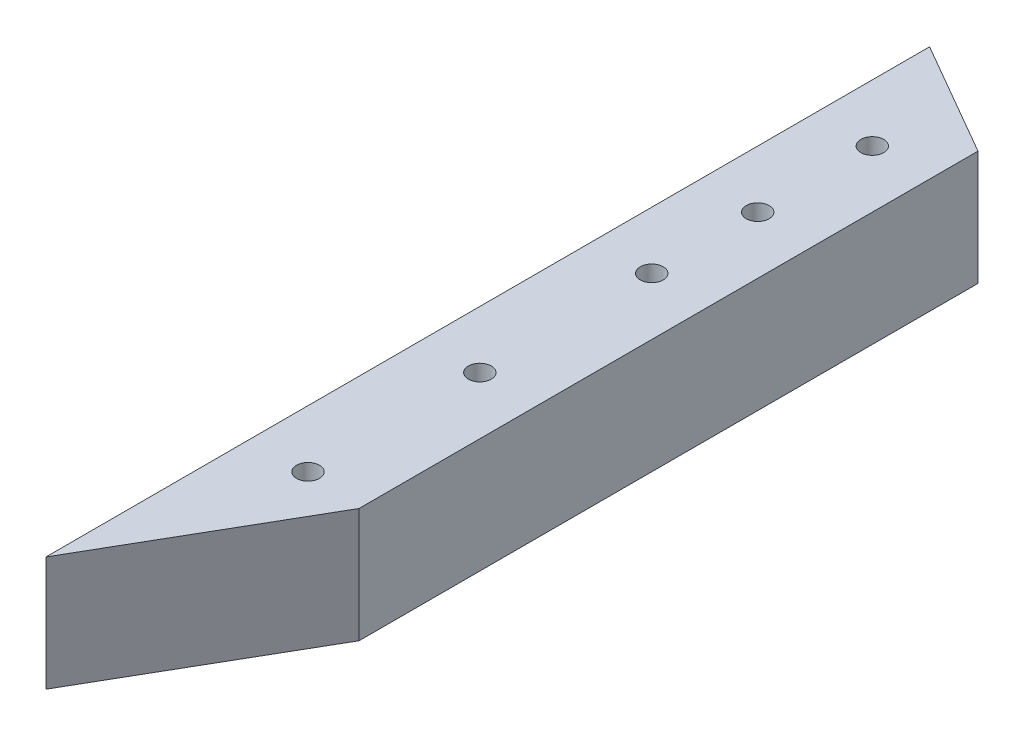
ISO-10303-21;
HEADER;
FILE_DESCRIPTION(('STEP AP214'),'2;1');
FILE_NAME('part.step','',(''),(''),'','','');
FILE_SCHEMA(('AUTOMOTIVE_DESIGN { 1 0 10303 214 1 1 1 1 }'));
ENDSEC;
DATA;
#1=APPLICATION_CONTEXT('core data for automotive mechanical design processes');
#2=APPLICATION_PROTOCOL_DEFINITION('international standard','automotive_design',2000,#1);
#3=PRODUCT_CONTEXT('',#1,'mechanical');
#4=PRODUCT('Part','Part','',(#3));
#5=PRODUCT_RELATED_PRODUCT_CATEGORY('part','',(#4));
#6=PRODUCT_DEFINITION_FORMATION('','',#4);
#7=PRODUCT_DEFINITION_CONTEXT('part definition',#1,'design');
#8=PRODUCT_DEFINITION('design','',#6,#7);
#9=PRODUCT_DEFINITION_SHAPE('','',#8);
#10=(LENGTH_UNIT() NAMED_UNIT(*) SI_UNIT(.MILLI.,.METRE.));
#11=(NAMED_UNIT(*) PLANE_ANGLE_UNIT() SI_UNIT($,.RADIAN.));
#12=(NAMED_UNIT(*) SI_UNIT($,.STERADIAN.) SOLID_ANGLE_UNIT());
#13=UNCERTAINTY_MEASURE_WITH_UNIT(LENGTH_MEASURE(1.E-05),#10,'distance_accuracy_value','');
#14=(GEOMETRIC_REPRESENTATION_CONTEXT(3) GLOBAL_UNCERTAINTY_ASSIGNED_CONTEXT((#13)) GLOBAL_UNIT_ASSIGNED_CONTEXT((#10,
#11,#12)) REPRESENTATION_CONTEXT('',''));
#15=CARTESIAN_POINT('',(0.,0.,0.));
#16=DIRECTION('',(0.,0.,1.));
#17=DIRECTION('',(1.,0.,0.));
#18=AXIS2_PLACEMENT_3D('',#15,#16,#17);
#19=CARTESIAN_POINT('',(0.,0.,154.23));
#20=DIRECTION('',(1.,0.,0.));
#21=DIRECTION('',(0.,0.,-1.));
#22=AXIS2_PLACEMENT_3D('',#19,#20,#21);
#23=PLANE('',#22);
#24=DIRECTION('',(0.,-1.,0.));
#25=VECTOR('',#24,1.);
#26=CARTESIAN_POINT('',(0.,0.,0.));
#27=LINE('',#26,#25);
#28=CARTESIAN_POINT('',(0.,20.,0.));
#29=VERTEX_POINT('',#28);
#30=CARTESIAN_POINT('',(0.,0.,0.));
#31=VERTEX_POINT('',#30);
#32=EDGE_CURVE('E96',#29,#31,#27,.T.);
#33=ORIENTED_EDGE('',*,*,#32,.T.);
#34=DIRECTION('',(0.,0.,-1.));
#35=VECTOR('',#34,1.);
#36=CARTESIAN_POINT('',(0.,0.,154.23));
#37=LINE('',#36,#35);
#38=CARTESIAN_POINT('',(0.,0.,154.23));
#39=VERTEX_POINT('',#38);
#40=EDGE_CURVE('E11',#39,#31,#37,.T.);
#41=ORIENTED_EDGE('',*,*,#40,.F.);
#42=DIRECTION('',(0.,-1.,0.));
#43=VECTOR('',#42,1.);
#44=CARTESIAN_POINT('',(0.,0.,154.23));
#45=LINE('',#44,#43);
#46=CARTESIAN_POINT('',(0.,20.,154.23));
#47=VERTEX_POINT('',#46);
#48=EDGE_CURVE('E93',#47,#39,#45,.T.);
#49=ORIENTED_EDGE('',*,*,#48,.F.);
#50=DIRECTION('',(0.,0.,-1.));
#51=VECTOR('',#50,1.);
#52=CARTESIAN_POINT('',(0.,20.,154.23));
#53=LINE('',#52,#51);
#54=EDGE_CURVE('E86',#47,#29,#53,.T.);
#55=ORIENTED_EDGE('',*,*,#54,.T.);
#56=EDGE_LOOP('',(#33,#41,#49,#55));
#57=FACE_BOUND('',#56,.T.);
#58=ADVANCED_FACE('F36',(#57),#23,.F.);
#59=CARTESIAN_POINT('',(0.,0.,154.23));
#60=DIRECTION('',(0.,1.,0.));
#61=DIRECTION('',(0.,0.,1.));
#62=AXIS2_PLACEMENT_3D('',#59,#60,#61);
#63=PLANE('',#62);
#64=CARTESIAN_POINT('',(10.,0.,40.));
#65=DIRECTION('',(0.,1.,0.));
#66=DIRECTION('',(0.,0.,1.));
#67=AXIS2_PLACEMENT_3D('',#64,#65,#66);
#68=CIRCLE('',#67,2.);
#69=CARTESIAN_POINT('',(10.,0.,42.));
#70=VERTEX_POINT('',#69);
#71=EDGE_CURVE('E116',#70,#70,#68,.T.);
#72=ORIENTED_EDGE('',*,*,#71,.T.);
#73=EDGE_LOOP('',(#72));
#74=FACE_BOUND('',#73,.T.);
#75=CARTESIAN_POINT('',(10.,0.,20.));
#76=DIRECTION('',(0.,1.,0.));
#77=DIRECTION('',(0.,0.,1.));
#78=AXIS2_PLACEMENT_3D('',#75,#76,#77);
#79=CIRCLE('',#78,2.);
#80=CARTESIAN_POINT('',(10.,0.,22.));
#81=VERTEX_POINT('',#80);
#82=EDGE_CURVE('E122',#81,#81,#79,.T.);
#83=ORIENTED_EDGE('',*,*,#82,.T.);
#84=EDGE_LOOP('',(#83));
#85=FACE_BOUND('',#84,.T.);
#86=CARTESIAN_POINT('',(10.,0.,58.5));
#87=DIRECTION('',(0.,1.,0.));
#88=DIRECTION('',(0.,0.,1.));
#89=AXIS2_PLACEMENT_3D('',#86,#87,#88);
#90=CIRCLE('',#89,2.);
#91=CARTESIAN_POINT('',(10.,0.,60.5));
#92=VERTEX_POINT('',#91);
#93=EDGE_CURVE('E128',#92,#92,#90,.T.);
#94=ORIENTED_EDGE('',*,*,#93,.T.);
#95=EDGE_LOOP('',(#94));
#96=FACE_BOUND('',#95,.T.);
#97=CARTESIAN_POINT('',(10.,0.,118.5));
#98=DIRECTION('',(0.,1.,0.));
#99=DIRECTION('',(0.,0.,1.));
#100=AXIS2_PLACEMENT_3D('',#97,#98,#99);
#101=CIRCLE('',#100,2.);
#102=CARTESIAN_POINT('',(10.,0.,120.5));
#103=VERTEX_POINT('',#102);
#104=EDGE_CURVE('E110',#103,#103,#101,.T.);
#105=ORIENTED_EDGE('',*,*,#104,.T.);
#106=EDGE_LOOP('',(#105));
#107=FACE_BOUND('',#106,.T.);
#108=CARTESIAN_POINT('',(10.,0.,88.5));
#109=DIRECTION('',(0.,1.,0.));
#110=DIRECTION('',(0.,0.,1.));
#111=AXIS2_PLACEMENT_3D('',#108,#109,#110);
#112=CIRCLE('',#111,2.);
#113=CARTESIAN_POINT('',(10.,0.,90.5));
#114=VERTEX_POINT('',#113);
#115=EDGE_CURVE('E105',#114,#114,#112,.T.);
#116=ORIENTED_EDGE('',*,*,#115,.T.);
#117=EDGE_LOOP('',(#116));
#118=FACE_BOUND('',#117,.T.);
#119=DIRECTION('',(0.,0.,-1.));
#120=VECTOR('',#119,1.);
#121=CARTESIAN_POINT('',(20.,0.,154.23));
#122=LINE('',#121,#120);
#123=CARTESIAN_POINT('',(20.,0.,119.588983848623));
#124=VERTEX_POINT('',#123);
#125=CARTESIAN_POINT('',(20.,0.,11.5470053837924));
#126=VERTEX_POINT('',#125);
#127=EDGE_CURVE('E44',#124,#126,#122,.T.);
#128=ORIENTED_EDGE('',*,*,#127,.F.);
#129=DIRECTION('',(-0.500000000000004,0.,0.866025403784436));
#130=VECTOR('',#129,1.);
#131=CARTESIAN_POINT('',(0.,0.,154.23));
#132=LINE('',#131,#130);
#133=EDGE_CURVE('E73',#124,#39,#132,.T.);
#134=ORIENTED_EDGE('',*,*,#133,.T.);
#135=ORIENTED_EDGE('',*,*,#40,.T.);
#136=DIRECTION('',(0.86602540378444,0.,0.499999999999998));
#137=VECTOR('',#136,1.);
#138=CARTESIAN_POINT('',(66.7835490128368,0.,38.5574999999996));
#139=LINE('',#138,#137);
#140=EDGE_CURVE('E78',#31,#126,#139,.T.);
#141=ORIENTED_EDGE('',*,*,#140,.T.);
#142=EDGE_LOOP('',(#128,#134,#135,#141));
#143=FACE_BOUND('',#142,.T.);
#144=ADVANCED_FACE('F137',(#74,#85,#96,#107,#118,#143),#63,.F.);
#145=CARTESIAN_POINT('',(20.,0.,154.23));
#146=DIRECTION('',(-1.,0.,0.));
#147=DIRECTION('',(0.,0.,1.));
#148=AXIS2_PLACEMENT_3D('',#145,#146,#147);
#149=PLANE('',#148);
#150=DIRECTION('',(0.,0.,-1.));
#151=VECTOR('',#150,1.);
#152=CARTESIAN_POINT('',(20.,20.,154.23));
#153=LINE('',#152,#151);
#154=CARTESIAN_POINT('',(20.,20.,119.588983848623));
#155=VERTEX_POINT('',#154);
#156=CARTESIAN_POINT('',(20.,20.,11.5470053837924));
#157=VERTEX_POINT('',#156);
#158=EDGE_CURVE('E84',#155,#157,#153,.T.);
#159=ORIENTED_EDGE('',*,*,#158,.F.);
#160=DIRECTION('',(0.,1.,0.));
#161=VECTOR('',#160,1.);
#162=CARTESIAN_POINT('',(20.,-134.23,119.588983848623));
#163=LINE('',#162,#161);
#164=EDGE_CURVE('E70',#124,#155,#163,.T.);
#165=ORIENTED_EDGE('',*,*,#164,.F.);
#166=ORIENTED_EDGE('',*,*,#127,.T.);
#167=DIRECTION('',(0.,1.,0.));
#168=VECTOR('',#167,1.);
#169=CARTESIAN_POINT('',(20.,-134.23,11.5470053837924));
#170=LINE('',#169,#168);
#171=EDGE_CURVE('E88',#126,#157,#170,.T.);
#172=ORIENTED_EDGE('',*,*,#171,.T.);
#173=EDGE_LOOP('',(#159,#165,#166,#172));
#174=FACE_BOUND('',#173,.T.);
#175=ADVANCED_FACE('F91',(#174),#149,.F.);
#176=CARTESIAN_POINT('',(0.,20.,154.23));
#177=DIRECTION('',(0.,-1.,0.));
#178=DIRECTION('',(0.,0.,-1.));
#179=AXIS2_PLACEMENT_3D('',#176,#177,#178);
#180=PLANE('',#179);
#181=CARTESIAN_POINT('',(10.,20.,40.));
#182=DIRECTION('',(0.,1.,0.));
#183=DIRECTION('',(0.,0.,1.));
#184=AXIS2_PLACEMENT_3D('',#181,#182,#183);
#185=CIRCLE('',#184,2.);
#186=CARTESIAN_POINT('',(10.,20.,42.));
#187=VERTEX_POINT('',#186);
#188=EDGE_CURVE('E113',#187,#187,#185,.T.);
#189=ORIENTED_EDGE('',*,*,#188,.F.);
#190=EDGE_LOOP('',(#189));
#191=FACE_BOUND('',#190,.T.);
#192=CARTESIAN_POINT('',(10.,20.,20.));
#193=DIRECTION('',(0.,1.,0.));
#194=DIRECTION('',(0.,0.,1.));
#195=AXIS2_PLACEMENT_3D('',#192,#193,#194);
#196=CIRCLE('',#195,2.);
#197=CARTESIAN_POINT('',(10.,20.,22.));
#198=VERTEX_POINT('',#197);
#199=EDGE_CURVE('E119',#198,#198,#196,.T.);
#200=ORIENTED_EDGE('',*,*,#199,.F.);
#201=EDGE_LOOP('',(#200));
#202=FACE_BOUND('',#201,.T.);
#203=CARTESIAN_POINT('',(10.,20.,58.5));
#204=DIRECTION('',(0.,1.,0.));
#205=DIRECTION('',(0.,0.,1.));
#206=AXIS2_PLACEMENT_3D('',#203,#204,#205);
#207=CIRCLE('',#206,2.);
#208=CARTESIAN_POINT('',(10.,20.,60.5));
#209=VERTEX_POINT('',#208);
#210=EDGE_CURVE('E125',#209,#209,#207,.T.);
#211=ORIENTED_EDGE('',*,*,#210,.F.);
#212=EDGE_LOOP('',(#211));
#213=FACE_BOUND('',#212,.T.);
#214=CARTESIAN_POINT('',(10.,20.,118.5));
#215=DIRECTION('',(0.,1.,0.));
#216=DIRECTION('',(0.,0.,1.));
#217=AXIS2_PLACEMENT_3D('',#214,#215,#216);
#218=CIRCLE('',#217,2.);
#219=CARTESIAN_POINT('',(10.,20.,120.5));
#220=VERTEX_POINT('',#219);
#221=EDGE_CURVE('E131',#220,#220,#218,.T.);
#222=ORIENTED_EDGE('',*,*,#221,.F.);
#223=EDGE_LOOP('',(#222));
#224=FACE_BOUND('',#223,.T.);
#225=CARTESIAN_POINT('',(10.,20.,88.5));
#226=DIRECTION('',(0.,1.,0.));
#227=DIRECTION('',(0.,0.,1.));
#228=AXIS2_PLACEMENT_3D('',#225,#226,#227);
#229=CIRCLE('',#228,2.);
#230=CARTESIAN_POINT('',(10.,20.,90.5));
#231=VERTEX_POINT('',#230);
#232=EDGE_CURVE('E107',#231,#231,#229,.T.);
#233=ORIENTED_EDGE('',*,*,#232,.F.);
#234=EDGE_LOOP('',(#233));
#235=FACE_BOUND('',#234,.T.);
#236=ORIENTED_EDGE('',*,*,#54,.F.);
#237=DIRECTION('',(-0.500000000000004,0.,0.866025403784436));
#238=VECTOR('',#237,1.);
#239=CARTESIAN_POINT('',(0.,20.,154.23));
#240=LINE('',#239,#238);
#241=EDGE_CURVE('E50',#155,#47,#240,.T.);
#242=ORIENTED_EDGE('',*,*,#241,.F.);
#243=ORIENTED_EDGE('',*,*,#158,.T.);
#244=DIRECTION('',(0.86602540378444,0.,0.499999999999998));
#245=VECTOR('',#244,1.);
#246=CARTESIAN_POINT('',(20.,20.,11.5470053837924));
#247=LINE('',#246,#245);
#248=EDGE_CURVE('E104',#29,#157,#247,.T.);
#249=ORIENTED_EDGE('',*,*,#248,.F.);
#250=EDGE_LOOP('',(#236,#242,#243,#249));
#251=FACE_BOUND('',#250,.T.);
#252=ADVANCED_FACE('F82',(#191,#202,#213,#224,#235,#251),#180,.F.);
#253=CARTESIAN_POINT('',(20.,-134.23,11.5470053837924));
#254=DIRECTION('',(-0.499999999999998,0.,0.86602540378444));
#255=DIRECTION('',(0.86602540378444,0.,0.499999999999998));
#256=AXIS2_PLACEMENT_3D('',#253,#254,#255);
#257=PLANE('',#256);
#258=ORIENTED_EDGE('',*,*,#32,.F.);
#259=ORIENTED_EDGE('',*,*,#248,.T.);
#260=ORIENTED_EDGE('',*,*,#171,.F.);
#261=ORIENTED_EDGE('',*,*,#140,.F.);
#262=EDGE_LOOP('',(#258,#259,#260,#261));
#263=FACE_BOUND('',#262,.T.);
#264=ADVANCED_FACE('F150',(#263),#257,.F.);
#265=CARTESIAN_POINT('',(0.,-134.23,154.23));
#266=DIRECTION('',(-0.866025403784436,0.,-0.500000000000004));
#267=DIRECTION('',(-0.500000000000004,0.,0.866025403784436));
#268=AXIS2_PLACEMENT_3D('',#265,#266,#267);
#269=PLANE('',#268);
#270=ORIENTED_EDGE('',*,*,#164,.T.);
#271=ORIENTED_EDGE('',*,*,#241,.T.);
#272=ORIENTED_EDGE('',*,*,#48,.T.);
#273=ORIENTED_EDGE('',*,*,#133,.F.);
#274=EDGE_LOOP('',(#270,#271,#272,#273));
#275=FACE_BOUND('',#274,.T.);
#276=ADVANCED_FACE('F71',(#275),#269,.F.);
#277=CARTESIAN_POINT('',(10.,0.,88.5));
#278=DIRECTION('',(0.,1.,0.));
#279=DIRECTION('',(0.,0.,1.));
#280=AXIS2_PLACEMENT_3D('',#277,#278,#279);
#281=CYLINDRICAL_SURFACE('',#280,2.);
#282=ORIENTED_EDGE('',*,*,#115,.F.);
#283=EDGE_LOOP('',(#282));
#284=FACE_BOUND('',#283,.T.);
#285=ORIENTED_EDGE('',*,*,#232,.T.);
#286=EDGE_LOOP('',(#285));
#287=FACE_BOUND('',#286,.T.);
#288=ADVANCED_FACE('F144',(#284,#287),#281,.F.);
#289=CARTESIAN_POINT('',(10.,0.,118.5));
#290=DIRECTION('',(0.,1.,0.));
#291=DIRECTION('',(0.,0.,1.));
#292=AXIS2_PLACEMENT_3D('',#289,#290,#291);
#293=CYLINDRICAL_SURFACE('',#292,2.);
#294=ORIENTED_EDGE('',*,*,#104,.F.);
#295=EDGE_LOOP('',(#294));
#296=FACE_BOUND('',#295,.T.);
#297=ORIENTED_EDGE('',*,*,#221,.T.);
#298=EDGE_LOOP('',(#297));
#299=FACE_BOUND('',#298,.T.);
#300=ADVANCED_FACE('F140',(#296,#299),#293,.F.);
#301=CARTESIAN_POINT('',(10.,0.,58.5));
#302=DIRECTION('',(0.,1.,0.));
#303=DIRECTION('',(0.,0.,1.));
#304=AXIS2_PLACEMENT_3D('',#301,#302,#303);
#305=CYLINDRICAL_SURFACE('',#304,2.);
#306=ORIENTED_EDGE('',*,*,#93,.F.);
#307=EDGE_LOOP('',(#306));
#308=FACE_BOUND('',#307,.T.);
#309=ORIENTED_EDGE('',*,*,#210,.T.);
#310=EDGE_LOOP('',(#309));
#311=FACE_BOUND('',#310,.T.);
#312=ADVANCED_FACE('F143',(#308,#311),#305,.F.);
#313=CARTESIAN_POINT('',(10.,0.,20.));
#314=DIRECTION('',(0.,1.,0.));
#315=DIRECTION('',(0.,0.,1.));
#316=AXIS2_PLACEMENT_3D('',#313,#314,#315);
#317=CYLINDRICAL_SURFACE('',#316,2.);
#318=ORIENTED_EDGE('',*,*,#82,.F.);
#319=EDGE_LOOP('',(#318));
#320=FACE_BOUND('',#319,.T.);
#321=ORIENTED_EDGE('',*,*,#199,.T.);
#322=EDGE_LOOP('',(#321));
#323=FACE_BOUND('',#322,.T.);
#324=ADVANCED_FACE('F211',(#320,#323),#317,.F.);
#325=CARTESIAN_POINT('',(10.,0.,40.));
#326=DIRECTION('',(0.,1.,0.));
#327=DIRECTION('',(0.,0.,1.));
#328=AXIS2_PLACEMENT_3D('',#325,#326,#327);
#329=CYLINDRICAL_SURFACE('',#328,2.);
#330=ORIENTED_EDGE('',*,*,#71,.F.);
#331=EDGE_LOOP('',(#330));
#332=FACE_BOUND('',#331,.T.);
#333=ORIENTED_EDGE('',*,*,#188,.T.);
#334=EDGE_LOOP('',(#333));
#335=FACE_BOUND('',#334,.T.);
#336=ADVANCED_FACE('F221',(#332,#335),#329,.F.);
#337=CLOSED_SHELL('',(#58,#144,#175,#252,#264,#276,#288,#300,#312,#324,#336));
#338=MANIFOLD_SOLID_BREP('B2',#337);
#339=ADVANCED_BREP_SHAPE_REPRESENTATION('',(#18,#338),#14);
#340=SHAPE_DEFINITION_REPRESENTATION(#9,#339);
ENDSEC;
END-ISO-10303-21;
